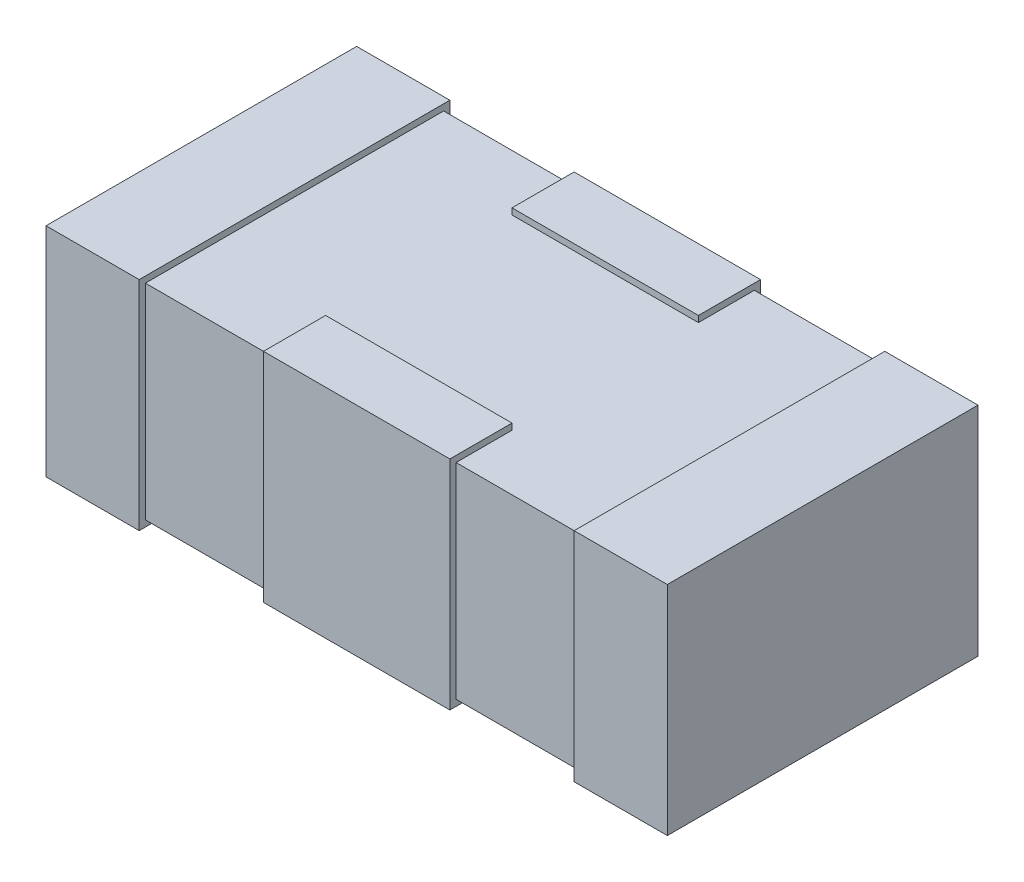
ISO-10303-21;
HEADER;
FILE_DESCRIPTION(('STEP AP214'),'2;1');
FILE_NAME('part.step','',(''),(''),'','','');
FILE_SCHEMA(('AUTOMOTIVE_DESIGN { 1 0 10303 214 1 1 1 1 }'));
ENDSEC;
DATA;
#1=APPLICATION_CONTEXT('core data for automotive mechanical design processes');
#2=APPLICATION_PROTOCOL_DEFINITION('international standard','automotive_design',2000,#1);
#3=PRODUCT_CONTEXT('',#1,'mechanical');
#4=PRODUCT('Part','Part','',(#3));
#5=PRODUCT_RELATED_PRODUCT_CATEGORY('part','',(#4));
#6=PRODUCT_DEFINITION_FORMATION('','',#4);
#7=PRODUCT_DEFINITION_CONTEXT('part definition',#1,'design');
#8=PRODUCT_DEFINITION('design','',#6,#7);
#9=PRODUCT_DEFINITION_SHAPE('','',#8);
#10=(LENGTH_UNIT() NAMED_UNIT(*) SI_UNIT(.MILLI.,.METRE.));
#11=(NAMED_UNIT(*) PLANE_ANGLE_UNIT() SI_UNIT($,.RADIAN.));
#12=(NAMED_UNIT(*) SI_UNIT($,.STERADIAN.) SOLID_ANGLE_UNIT());
#13=UNCERTAINTY_MEASURE_WITH_UNIT(LENGTH_MEASURE(1.E-05),#10,'distance_accuracy_value','');
#14=(GEOMETRIC_REPRESENTATION_CONTEXT(3) GLOBAL_UNCERTAINTY_ASSIGNED_CONTEXT((#13)) GLOBAL_UNIT_ASSIGNED_CONTEXT((#10,
#11,#12)) REPRESENTATION_CONTEXT('',''));
#15=CARTESIAN_POINT('',(0.,0.,0.));
#16=DIRECTION('',(0.,0.,1.));
#17=DIRECTION('',(1.,0.,0.));
#18=AXIS2_PLACEMENT_3D('',#15,#16,#17);
#19=CARTESIAN_POINT('',(0.5,0.35,-0.25));
#20=DIRECTION('',(-1.,0.,0.));
#21=DIRECTION('',(0.,0.,1.));
#22=AXIS2_PLACEMENT_3D('',#19,#20,#21);
#23=PLANE('',#22);
#24=DIRECTION('',(0.,1.,0.));
#25=VECTOR('',#24,1.);
#26=CARTESIAN_POINT('',(0.5,0.35,-0.25));
#27=LINE('',#26,#25);
#28=CARTESIAN_POINT('',(0.5,0.,-0.25));
#29=VERTEX_POINT('',#28);
#30=CARTESIAN_POINT('',(0.5,0.35,-0.25));
#31=VERTEX_POINT('',#30);
#32=EDGE_CURVE('E198',#29,#31,#27,.T.);
#33=ORIENTED_EDGE('',*,*,#32,.T.);
#34=DIRECTION('',(0.,0.,1.));
#35=VECTOR('',#34,1.);
#36=CARTESIAN_POINT('',(0.5,0.35,0.));
#37=LINE('',#36,#35);
#38=CARTESIAN_POINT('',(0.5,0.35,0.25));
#39=VERTEX_POINT('',#38);
#40=EDGE_CURVE('E207',#39,#31,#37,.F.);
#41=ORIENTED_EDGE('',*,*,#40,.F.);
#42=DIRECTION('',(0.,1.,0.));
#43=VECTOR('',#42,1.);
#44=CARTESIAN_POINT('',(0.5,0.35,0.25));
#45=LINE('',#44,#43);
#46=CARTESIAN_POINT('',(0.5,0.,0.25));
#47=VERTEX_POINT('',#46);
#48=EDGE_CURVE('E203',#39,#47,#45,.F.);
#49=ORIENTED_EDGE('',*,*,#48,.T.);
#50=DIRECTION('',(0.,0.,1.));
#51=VECTOR('',#50,1.);
#52=CARTESIAN_POINT('',(0.5,0.,0.));
#53=LINE('',#52,#51);
#54=EDGE_CURVE('E205',#47,#29,#53,.F.);
#55=ORIENTED_EDGE('',*,*,#54,.T.);
#56=EDGE_LOOP('',(#33,#41,#49,#55));
#57=FACE_BOUND('',#56,.T.);
#58=ADVANCED_FACE('F17',(#57),#23,.F.);
#59=CARTESIAN_POINT('',(-0.5,0.35,-0.25));
#60=DIRECTION('',(1.,0.,0.));
#61=DIRECTION('',(0.,0.,-1.));
#62=AXIS2_PLACEMENT_3D('',#59,#60,#61);
#63=PLANE('',#62);
#64=DIRECTION('',(0.,1.,0.));
#65=VECTOR('',#64,1.);
#66=CARTESIAN_POINT('',(-0.5,0.35,0.25));
#67=LINE('',#66,#65);
#68=CARTESIAN_POINT('',(-0.5,0.,0.25));
#69=VERTEX_POINT('',#68);
#70=CARTESIAN_POINT('',(-0.5,0.35,0.25));
#71=VERTEX_POINT('',#70);
#72=EDGE_CURVE('E282',#69,#71,#67,.T.);
#73=ORIENTED_EDGE('',*,*,#72,.T.);
#74=DIRECTION('',(0.,0.,1.));
#75=VECTOR('',#74,1.);
#76=CARTESIAN_POINT('',(-0.5,0.35,0.));
#77=LINE('',#76,#75);
#78=CARTESIAN_POINT('',(-0.5,0.35,-0.25));
#79=VERTEX_POINT('',#78);
#80=EDGE_CURVE('E280',#79,#71,#77,.T.);
#81=ORIENTED_EDGE('',*,*,#80,.F.);
#82=DIRECTION('',(0.,1.,0.));
#83=VECTOR('',#82,1.);
#84=CARTESIAN_POINT('',(-0.5,0.35,-0.25));
#85=LINE('',#84,#83);
#86=CARTESIAN_POINT('',(-0.5,0.,-0.25));
#87=VERTEX_POINT('',#86);
#88=EDGE_CURVE('E272',#79,#87,#85,.F.);
#89=ORIENTED_EDGE('',*,*,#88,.T.);
#90=DIRECTION('',(0.,0.,1.));
#91=VECTOR('',#90,1.);
#92=CARTESIAN_POINT('',(-0.5,0.,0.));
#93=LINE('',#92,#91);
#94=EDGE_CURVE('E269',#87,#69,#93,.T.);
#95=ORIENTED_EDGE('',*,*,#94,.T.);
#96=EDGE_LOOP('',(#73,#81,#89,#95));
#97=FACE_BOUND('',#96,.T.);
#98=ADVANCED_FACE('F573',(#97),#63,.F.);
#99=CARTESIAN_POINT('',(-0.5,0.35,-0.25));
#100=DIRECTION('',(0.,0.,1.));
#101=DIRECTION('',(1.,0.,0.));
#102=AXIS2_PLACEMENT_3D('',#99,#100,#101);
#103=PLANE('',#102);
#104=DIRECTION('',(0.,1.,0.));
#105=VECTOR('',#104,1.);
#106=CARTESIAN_POINT('',(-0.15,0.34,-0.25));
#107=LINE('',#106,#105);
#108=CARTESIAN_POINT('',(-0.15,0.,-0.25));
#109=VERTEX_POINT('',#108);
#110=CARTESIAN_POINT('',(-0.15,0.35,-0.25));
#111=VERTEX_POINT('',#110);
#112=EDGE_CURVE('E238',#109,#111,#107,.T.);
#113=ORIENTED_EDGE('',*,*,#112,.T.);
#114=DIRECTION('',(1.,0.,0.));
#115=VECTOR('',#114,1.);
#116=CARTESIAN_POINT('',(0.,0.35,-0.25));
#117=LINE('',#116,#115);
#118=CARTESIAN_POINT('',(0.15,0.35,-0.25));
#119=VERTEX_POINT('',#118);
#120=EDGE_CURVE('E213',#119,#111,#117,.F.);
#121=ORIENTED_EDGE('',*,*,#120,.F.);
#122=DIRECTION('',(0.,1.,0.));
#123=VECTOR('',#122,1.);
#124=CARTESIAN_POINT('',(0.15,0.34,-0.25));
#125=LINE('',#124,#123);
#126=CARTESIAN_POINT('',(0.15,0.,-0.25));
#127=VERTEX_POINT('',#126);
#128=EDGE_CURVE('E239',#119,#127,#125,.F.);
#129=ORIENTED_EDGE('',*,*,#128,.T.);
#130=DIRECTION('',(1.,0.,0.));
#131=VECTOR('',#130,1.);
#132=CARTESIAN_POINT('',(0.,0.,-0.25));
#133=LINE('',#132,#131);
#134=EDGE_CURVE('E20',#127,#109,#133,.F.);
#135=ORIENTED_EDGE('',*,*,#134,.T.);
#136=EDGE_LOOP('',(#113,#121,#129,#135));
#137=FACE_BOUND('',#136,.T.);
#138=ADVANCED_FACE('F236',(#137),#103,.F.);
#139=CARTESIAN_POINT('',(0.,0.,0.));
#140=DIRECTION('',(0.,1.,0.));
#141=DIRECTION('',(0.,0.,1.));
#142=AXIS2_PLACEMENT_3D('',#139,#140,#141);
#143=PLANE('',#142);
#144=DIRECTION('',(0.,0.,-1.));
#145=VECTOR('',#144,1.);
#146=CARTESIAN_POINT('',(-0.15,0.,-0.25));
#147=LINE('',#146,#145);
#148=CARTESIAN_POINT('',(-0.15,0.,-0.15));
#149=VERTEX_POINT('',#148);
#150=EDGE_CURVE('E245',#149,#109,#147,.T.);
#151=ORIENTED_EDGE('',*,*,#150,.T.);
#152=ORIENTED_EDGE('',*,*,#134,.F.);
#153=DIRECTION('',(0.,0.,1.));
#154=VECTOR('',#153,1.);
#155=CARTESIAN_POINT('',(0.15,0.,-0.25));
#156=LINE('',#155,#154);
#157=CARTESIAN_POINT('',(0.15,0.,-0.15));
#158=VERTEX_POINT('',#157);
#159=EDGE_CURVE('E340',#127,#158,#156,.T.);
#160=ORIENTED_EDGE('',*,*,#159,.T.);
#161=DIRECTION('',(-1.,0.,0.));
#162=VECTOR('',#161,1.);
#163=CARTESIAN_POINT('',(-0.15,0.,-0.15));
#164=LINE('',#163,#162);
#165=EDGE_CURVE('E227',#158,#149,#164,.T.);
#166=ORIENTED_EDGE('',*,*,#165,.T.);
#167=EDGE_LOOP('',(#151,#152,#160,#166));
#168=FACE_BOUND('',#167,.T.);
#169=ADVANCED_FACE('F250',(#168),#143,.F.);
#170=CARTESIAN_POINT('',(-0.15,0.01,-0.15));
#171=DIRECTION('',(0.,0.,-1.));
#172=DIRECTION('',(-1.,0.,0.));
#173=AXIS2_PLACEMENT_3D('',#170,#171,#172);
#174=PLANE('',#173);
#175=DIRECTION('',(0.,1.,0.));
#176=VECTOR('',#175,1.);
#177=CARTESIAN_POINT('',(0.15,0.34,-0.15));
#178=LINE('',#177,#176);
#179=CARTESIAN_POINT('',(0.15,0.01,-0.15));
#180=VERTEX_POINT('',#179);
#181=EDGE_CURVE('E337',#158,#180,#178,.T.);
#182=ORIENTED_EDGE('',*,*,#181,.T.);
#183=DIRECTION('',(1.,0.,0.));
#184=VECTOR('',#183,1.);
#185=CARTESIAN_POINT('',(0.,0.01,-0.15));
#186=LINE('',#185,#184);
#187=CARTESIAN_POINT('',(-0.15,0.01,-0.15));
#188=VERTEX_POINT('',#187);
#189=EDGE_CURVE('E259',#180,#188,#186,.F.);
#190=ORIENTED_EDGE('',*,*,#189,.T.);
#191=DIRECTION('',(0.,1.,0.));
#192=VECTOR('',#191,1.);
#193=CARTESIAN_POINT('',(-0.15,0.34,-0.15));
#194=LINE('',#193,#192);
#195=EDGE_CURVE('E251',#188,#149,#194,.F.);
#196=ORIENTED_EDGE('',*,*,#195,.T.);
#197=ORIENTED_EDGE('',*,*,#165,.F.);
#198=EDGE_LOOP('',(#182,#190,#196,#197));
#199=FACE_BOUND('',#198,.T.);
#200=ADVANCED_FACE('F473',(#199),#174,.F.);
#201=CARTESIAN_POINT('',(0.,0.35,0.));
#202=DIRECTION('',(0.,1.,0.));
#203=DIRECTION('',(0.,0.,1.));
#204=AXIS2_PLACEMENT_3D('',#201,#202,#203);
#205=PLANE('',#204);
#206=DIRECTION('',(0.,0.,1.));
#207=VECTOR('',#206,1.);
#208=CARTESIAN_POINT('',(0.15,0.35,-0.25));
#209=LINE('',#208,#207);
#210=CARTESIAN_POINT('',(0.15,0.35,-0.15));
#211=VERTEX_POINT('',#210);
#212=EDGE_CURVE('E328',#211,#119,#209,.F.);
#213=ORIENTED_EDGE('',*,*,#212,.T.);
#214=ORIENTED_EDGE('',*,*,#120,.T.);
#215=DIRECTION('',(0.,0.,-1.));
#216=VECTOR('',#215,1.);
#217=CARTESIAN_POINT('',(-0.15,0.35,-0.25));
#218=LINE('',#217,#216);
#219=CARTESIAN_POINT('',(-0.15,0.35,-0.15));
#220=VERTEX_POINT('',#219);
#221=EDGE_CURVE('E248',#111,#220,#218,.F.);
#222=ORIENTED_EDGE('',*,*,#221,.T.);
#223=DIRECTION('',(-1.,0.,0.));
#224=VECTOR('',#223,1.);
#225=CARTESIAN_POINT('',(-0.15,0.35,-0.15));
#226=LINE('',#225,#224);
#227=EDGE_CURVE('E343',#220,#211,#226,.F.);
#228=ORIENTED_EDGE('',*,*,#227,.T.);
#229=EDGE_LOOP('',(#213,#214,#222,#228));
#230=FACE_BOUND('',#229,.T.);
#231=ADVANCED_FACE('F348',(#230),#205,.T.);
#232=CARTESIAN_POINT('',(-0.5,0.35,0.25));
#233=DIRECTION('',(0.,0.,-1.));
#234=DIRECTION('',(-1.,0.,0.));
#235=AXIS2_PLACEMENT_3D('',#232,#233,#234);
#236=PLANE('',#235);
#237=DIRECTION('',(1.,0.,0.));
#238=VECTOR('',#237,1.);
#239=CARTESIAN_POINT('',(0.,0.,0.25));
#240=LINE('',#239,#238);
#241=CARTESIAN_POINT('',(0.35,0.,0.25));
#242=VERTEX_POINT('',#241);
#243=EDGE_CURVE('E212',#242,#47,#240,.T.);
#244=ORIENTED_EDGE('',*,*,#243,.T.);
#245=ORIENTED_EDGE('',*,*,#48,.F.);
#246=DIRECTION('',(1.,0.,0.));
#247=VECTOR('',#246,1.);
#248=CARTESIAN_POINT('',(0.,0.35,0.25));
#249=LINE('',#248,#247);
#250=CARTESIAN_POINT('',(0.35,0.35,0.25));
#251=VERTEX_POINT('',#250);
#252=EDGE_CURVE('E294',#251,#39,#249,.T.);
#253=ORIENTED_EDGE('',*,*,#252,.F.);
#254=DIRECTION('',(0.,1.,0.));
#255=VECTOR('',#254,1.);
#256=CARTESIAN_POINT('',(0.35,0.34,0.25));
#257=LINE('',#256,#255);
#258=EDGE_CURVE('E223',#251,#242,#257,.F.);
#259=ORIENTED_EDGE('',*,*,#258,.T.);
#260=EDGE_LOOP('',(#244,#245,#253,#259));
#261=FACE_BOUND('',#260,.T.);
#262=ADVANCED_FACE('F222',(#261),#236,.F.);
#263=CARTESIAN_POINT('',(0.,0.,0.));
#264=DIRECTION('',(0.,1.,0.));
#265=DIRECTION('',(0.,0.,1.));
#266=AXIS2_PLACEMENT_3D('',#263,#264,#265);
#267=PLANE('',#266);
#268=DIRECTION('',(1.,0.,0.));
#269=VECTOR('',#268,1.);
#270=CARTESIAN_POINT('',(-0.5,0.,-0.25));
#271=LINE('',#270,#269);
#272=CARTESIAN_POINT('',(0.35,0.,-0.25));
#273=VERTEX_POINT('',#272);
#274=EDGE_CURVE('E219',#273,#29,#271,.T.);
#275=ORIENTED_EDGE('',*,*,#274,.T.);
#276=ORIENTED_EDGE('',*,*,#54,.F.);
#277=ORIENTED_EDGE('',*,*,#243,.F.);
#278=DIRECTION('',(0.,0.,-1.));
#279=VECTOR('',#278,1.);
#280=CARTESIAN_POINT('',(0.35,0.,0.25));
#281=LINE('',#280,#279);
#282=EDGE_CURVE('E313',#242,#273,#281,.T.);
#283=ORIENTED_EDGE('',*,*,#282,.T.);
#284=EDGE_LOOP('',(#275,#276,#277,#283));
#285=FACE_BOUND('',#284,.T.);
#286=ADVANCED_FACE('F216',(#285),#267,.F.);
#287=CARTESIAN_POINT('',(-0.5,0.35,-0.25));
#288=DIRECTION('',(0.,0.,1.));
#289=DIRECTION('',(1.,0.,0.));
#290=AXIS2_PLACEMENT_3D('',#287,#288,#289);
#291=PLANE('',#290);
#292=DIRECTION('',(0.,1.,0.));
#293=VECTOR('',#292,1.);
#294=CARTESIAN_POINT('',(0.35,0.34,-0.25));
#295=LINE('',#294,#293);
#296=CARTESIAN_POINT('',(0.35,0.35,-0.25));
#297=VERTEX_POINT('',#296);
#298=EDGE_CURVE('E299',#273,#297,#295,.T.);
#299=ORIENTED_EDGE('',*,*,#298,.T.);
#300=DIRECTION('',(1.,0.,0.));
#301=VECTOR('',#300,1.);
#302=CARTESIAN_POINT('',(0.,0.35,-0.25));
#303=LINE('',#302,#301);
#304=EDGE_CURVE('E291',#31,#297,#303,.F.);
#305=ORIENTED_EDGE('',*,*,#304,.F.);
#306=ORIENTED_EDGE('',*,*,#32,.F.);
#307=ORIENTED_EDGE('',*,*,#274,.F.);
#308=EDGE_LOOP('',(#299,#305,#306,#307));
#309=FACE_BOUND('',#308,.T.);
#310=ADVANCED_FACE('F297',(#309),#291,.F.);
#311=CARTESIAN_POINT('',(0.,0.35,0.));
#312=DIRECTION('',(0.,1.,0.));
#313=DIRECTION('',(0.,0.,1.));
#314=AXIS2_PLACEMENT_3D('',#311,#312,#313);
#315=PLANE('',#314);
#316=ORIENTED_EDGE('',*,*,#40,.T.);
#317=ORIENTED_EDGE('',*,*,#304,.T.);
#318=DIRECTION('',(0.,0.,-1.));
#319=VECTOR('',#318,1.);
#320=CARTESIAN_POINT('',(0.35,0.35,0.25));
#321=LINE('',#320,#319);
#322=EDGE_CURVE('E304',#297,#251,#321,.F.);
#323=ORIENTED_EDGE('',*,*,#322,.T.);
#324=ORIENTED_EDGE('',*,*,#252,.T.);
#325=EDGE_LOOP('',(#316,#317,#323,#324));
#326=FACE_BOUND('',#325,.T.);
#327=ADVANCED_FACE('F303',(#326),#315,.T.);
#328=CARTESIAN_POINT('',(-0.5,0.35,0.25));
#329=DIRECTION('',(0.,0.,-1.));
#330=DIRECTION('',(-1.,0.,0.));
#331=AXIS2_PLACEMENT_3D('',#328,#329,#330);
#332=PLANE('',#331);
#333=DIRECTION('',(0.,1.,0.));
#334=VECTOR('',#333,1.);
#335=CARTESIAN_POINT('',(0.15,0.34,0.25));
#336=LINE('',#335,#334);
#337=CARTESIAN_POINT('',(0.15,0.,0.25));
#338=VERTEX_POINT('',#337);
#339=CARTESIAN_POINT('',(0.15,0.35,0.25));
#340=VERTEX_POINT('',#339);
#341=EDGE_CURVE('E417',#338,#340,#336,.T.);
#342=ORIENTED_EDGE('',*,*,#341,.T.);
#343=DIRECTION('',(1.,0.,0.));
#344=VECTOR('',#343,1.);
#345=CARTESIAN_POINT('',(0.,0.35,0.25));
#346=LINE('',#345,#344);
#347=CARTESIAN_POINT('',(-0.15,0.35,0.25));
#348=VERTEX_POINT('',#347);
#349=EDGE_CURVE('E285',#348,#340,#346,.T.);
#350=ORIENTED_EDGE('',*,*,#349,.F.);
#351=DIRECTION('',(0.,1.,0.));
#352=VECTOR('',#351,1.);
#353=CARTESIAN_POINT('',(-0.15,0.34,0.25));
#354=LINE('',#353,#352);
#355=CARTESIAN_POINT('',(-0.15,0.,0.25));
#356=VERTEX_POINT('',#355);
#357=EDGE_CURVE('E407',#348,#356,#354,.F.);
#358=ORIENTED_EDGE('',*,*,#357,.T.);
#359=DIRECTION('',(1.,0.,0.));
#360=VECTOR('',#359,1.);
#361=CARTESIAN_POINT('',(0.,0.,0.25));
#362=LINE('',#361,#360);
#363=EDGE_CURVE('E289',#356,#338,#362,.T.);
#364=ORIENTED_EDGE('',*,*,#363,.T.);
#365=EDGE_LOOP('',(#342,#350,#358,#364));
#366=FACE_BOUND('',#365,.T.);
#367=ADVANCED_FACE('F499',(#366),#332,.F.);
#368=CARTESIAN_POINT('',(0.,0.,0.));
#369=DIRECTION('',(0.,1.,0.));
#370=DIRECTION('',(0.,0.,1.));
#371=AXIS2_PLACEMENT_3D('',#368,#369,#370);
#372=PLANE('',#371);
#373=DIRECTION('',(1.,0.,0.));
#374=VECTOR('',#373,1.);
#375=CARTESIAN_POINT('',(0.15,0.,0.15));
#376=LINE('',#375,#374);
#377=CARTESIAN_POINT('',(-0.15,0.,0.15));
#378=VERTEX_POINT('',#377);
#379=CARTESIAN_POINT('',(0.15,0.,0.15));
#380=VERTEX_POINT('',#379);
#381=EDGE_CURVE('E287',#378,#380,#376,.T.);
#382=ORIENTED_EDGE('',*,*,#381,.T.);
#383=DIRECTION('',(0.,0.,1.));
#384=VECTOR('',#383,1.);
#385=CARTESIAN_POINT('',(0.15,0.,0.15));
#386=LINE('',#385,#384);
#387=EDGE_CURVE('E420',#380,#338,#386,.T.);
#388=ORIENTED_EDGE('',*,*,#387,.T.);
#389=ORIENTED_EDGE('',*,*,#363,.F.);
#390=DIRECTION('',(0.,0.,-1.));
#391=VECTOR('',#390,1.);
#392=CARTESIAN_POINT('',(-0.15,0.,0.15));
#393=LINE('',#392,#391);
#394=EDGE_CURVE('E404',#356,#378,#393,.T.);
#395=ORIENTED_EDGE('',*,*,#394,.T.);
#396=EDGE_LOOP('',(#382,#388,#389,#395));
#397=FACE_BOUND('',#396,.T.);
#398=ADVANCED_FACE('F502',(#397),#372,.F.);
#399=CARTESIAN_POINT('',(0.15,0.01,0.15));
#400=DIRECTION('',(0.,0.,1.));
#401=DIRECTION('',(1.,0.,0.));
#402=AXIS2_PLACEMENT_3D('',#399,#400,#401);
#403=PLANE('',#402);
#404=DIRECTION('',(0.,1.,0.));
#405=VECTOR('',#404,1.);
#406=CARTESIAN_POINT('',(-0.15,0.34,0.15));
#407=LINE('',#406,#405);
#408=CARTESIAN_POINT('',(-0.15,0.01,0.15));
#409=VERTEX_POINT('',#408);
#410=EDGE_CURVE('E401',#378,#409,#407,.T.);
#411=ORIENTED_EDGE('',*,*,#410,.T.);
#412=DIRECTION('',(1.,0.,0.));
#413=VECTOR('',#412,1.);
#414=CARTESIAN_POINT('',(0.,0.01,0.15));
#415=LINE('',#414,#413);
#416=CARTESIAN_POINT('',(0.15,0.01,0.15));
#417=VERTEX_POINT('',#416);
#418=EDGE_CURVE('E261',#409,#417,#415,.T.);
#419=ORIENTED_EDGE('',*,*,#418,.T.);
#420=DIRECTION('',(0.,1.,0.));
#421=VECTOR('',#420,1.);
#422=CARTESIAN_POINT('',(0.15,0.34,0.15));
#423=LINE('',#422,#421);
#424=EDGE_CURVE('E423',#417,#380,#423,.F.);
#425=ORIENTED_EDGE('',*,*,#424,.T.);
#426=ORIENTED_EDGE('',*,*,#381,.F.);
#427=EDGE_LOOP('',(#411,#419,#425,#426));
#428=FACE_BOUND('',#427,.T.);
#429=ADVANCED_FACE('F509',(#428),#403,.F.);
#430=CARTESIAN_POINT('',(0.,0.35,0.));
#431=DIRECTION('',(0.,1.,0.));
#432=DIRECTION('',(0.,0.,1.));
#433=AXIS2_PLACEMENT_3D('',#430,#431,#432);
#434=PLANE('',#433);
#435=DIRECTION('',(0.,0.,-1.));
#436=VECTOR('',#435,1.);
#437=CARTESIAN_POINT('',(-0.15,0.35,0.15));
#438=LINE('',#437,#436);
#439=CARTESIAN_POINT('',(-0.15,0.35,0.15));
#440=VERTEX_POINT('',#439);
#441=EDGE_CURVE('E393',#440,#348,#438,.F.);
#442=ORIENTED_EDGE('',*,*,#441,.T.);
#443=ORIENTED_EDGE('',*,*,#349,.T.);
#444=DIRECTION('',(0.,0.,1.));
#445=VECTOR('',#444,1.);
#446=CARTESIAN_POINT('',(0.15,0.35,0.15));
#447=LINE('',#446,#445);
#448=CARTESIAN_POINT('',(0.15,0.35,0.15));
#449=VERTEX_POINT('',#448);
#450=EDGE_CURVE('E415',#340,#449,#447,.F.);
#451=ORIENTED_EDGE('',*,*,#450,.T.);
#452=DIRECTION('',(1.,0.,0.));
#453=VECTOR('',#452,1.);
#454=CARTESIAN_POINT('',(-0.15,0.35,0.15));
#455=LINE('',#454,#453);
#456=EDGE_CURVE('E410',#449,#440,#455,.F.);
#457=ORIENTED_EDGE('',*,*,#456,.T.);
#458=EDGE_LOOP('',(#442,#443,#451,#457));
#459=FACE_BOUND('',#458,.T.);
#460=ADVANCED_FACE('F513',(#459),#434,.T.);
#461=CARTESIAN_POINT('',(-0.5,0.35,0.25));
#462=DIRECTION('',(0.,0.,-1.));
#463=DIRECTION('',(-1.,0.,0.));
#464=AXIS2_PLACEMENT_3D('',#461,#462,#463);
#465=PLANE('',#464);
#466=DIRECTION('',(0.,1.,0.));
#467=VECTOR('',#466,1.);
#468=CARTESIAN_POINT('',(-0.35,0.34,0.25));
#469=LINE('',#468,#467);
#470=CARTESIAN_POINT('',(-0.35,0.,0.25));
#471=VERTEX_POINT('',#470);
#472=CARTESIAN_POINT('',(-0.35,0.35,0.25));
#473=VERTEX_POINT('',#472);
#474=EDGE_CURVE('E385',#471,#473,#469,.T.);
#475=ORIENTED_EDGE('',*,*,#474,.T.);
#476=DIRECTION('',(1.,0.,0.));
#477=VECTOR('',#476,1.);
#478=CARTESIAN_POINT('',(0.,0.35,0.25));
#479=LINE('',#478,#477);
#480=EDGE_CURVE('E278',#71,#473,#479,.T.);
#481=ORIENTED_EDGE('',*,*,#480,.F.);
#482=ORIENTED_EDGE('',*,*,#72,.F.);
#483=DIRECTION('',(1.,0.,0.));
#484=VECTOR('',#483,1.);
#485=CARTESIAN_POINT('',(0.,0.,0.25));
#486=LINE('',#485,#484);
#487=EDGE_CURVE('E266',#69,#471,#486,.T.);
#488=ORIENTED_EDGE('',*,*,#487,.T.);
#489=EDGE_LOOP('',(#475,#481,#482,#488));
#490=FACE_BOUND('',#489,.T.);
#491=ADVANCED_FACE('F515',(#490),#465,.F.);
#492=CARTESIAN_POINT('',(0.,0.35,0.));
#493=DIRECTION('',(0.,1.,0.));
#494=DIRECTION('',(0.,0.,1.));
#495=AXIS2_PLACEMENT_3D('',#492,#493,#494);
#496=PLANE('',#495);
#497=ORIENTED_EDGE('',*,*,#80,.T.);
#498=ORIENTED_EDGE('',*,*,#480,.T.);
#499=DIRECTION('',(0.,0.,1.));
#500=VECTOR('',#499,1.);
#501=CARTESIAN_POINT('',(-0.35,0.35,-0.25));
#502=LINE('',#501,#500);
#503=CARTESIAN_POINT('',(-0.35,0.35,-0.25));
#504=VERTEX_POINT('',#503);
#505=EDGE_CURVE('E382',#473,#504,#502,.F.);
#506=ORIENTED_EDGE('',*,*,#505,.T.);
#507=DIRECTION('',(1.,0.,0.));
#508=VECTOR('',#507,1.);
#509=CARTESIAN_POINT('',(-0.5,0.35,-0.25));
#510=LINE('',#509,#508);
#511=EDGE_CURVE('E275',#504,#79,#510,.F.);
#512=ORIENTED_EDGE('',*,*,#511,.T.);
#513=EDGE_LOOP('',(#497,#498,#506,#512));
#514=FACE_BOUND('',#513,.T.);
#515=ADVANCED_FACE('F522',(#514),#496,.T.);
#516=CARTESIAN_POINT('',(-0.5,0.35,-0.25));
#517=DIRECTION('',(0.,0.,1.));
#518=DIRECTION('',(1.,0.,0.));
#519=AXIS2_PLACEMENT_3D('',#516,#517,#518);
#520=PLANE('',#519);
#521=DIRECTION('',(1.,0.,0.));
#522=VECTOR('',#521,1.);
#523=CARTESIAN_POINT('',(0.,0.,-0.25));
#524=LINE('',#523,#522);
#525=CARTESIAN_POINT('',(-0.35,0.,-0.25));
#526=VERTEX_POINT('',#525);
#527=EDGE_CURVE('E263',#526,#87,#524,.F.);
#528=ORIENTED_EDGE('',*,*,#527,.T.);
#529=ORIENTED_EDGE('',*,*,#88,.F.);
#530=ORIENTED_EDGE('',*,*,#511,.F.);
#531=DIRECTION('',(0.,1.,0.));
#532=VECTOR('',#531,1.);
#533=CARTESIAN_POINT('',(-0.35,0.34,-0.25));
#534=LINE('',#533,#532);
#535=EDGE_CURVE('E379',#504,#526,#534,.F.);
#536=ORIENTED_EDGE('',*,*,#535,.T.);
#537=EDGE_LOOP('',(#528,#529,#530,#536));
#538=FACE_BOUND('',#537,.T.);
#539=ADVANCED_FACE('F560',(#538),#520,.F.);
#540=CARTESIAN_POINT('',(0.,0.,0.));
#541=DIRECTION('',(0.,1.,0.));
#542=DIRECTION('',(0.,0.,1.));
#543=AXIS2_PLACEMENT_3D('',#540,#541,#542);
#544=PLANE('',#543);
#545=DIRECTION('',(0.,0.,1.));
#546=VECTOR('',#545,1.);
#547=CARTESIAN_POINT('',(-0.35,0.,-0.25));
#548=LINE('',#547,#546);
#549=EDGE_CURVE('E376',#526,#471,#548,.T.);
#550=ORIENTED_EDGE('',*,*,#549,.T.);
#551=ORIENTED_EDGE('',*,*,#487,.F.);
#552=ORIENTED_EDGE('',*,*,#94,.F.);
#553=ORIENTED_EDGE('',*,*,#527,.F.);
#554=EDGE_LOOP('',(#550,#551,#552,#553));
#555=FACE_BOUND('',#554,.T.);
#556=ADVANCED_FACE('F557',(#555),#544,.F.);
#557=CARTESIAN_POINT('',(0.,0.01,0.));
#558=DIRECTION('',(0.,1.,0.));
#559=DIRECTION('',(0.,0.,1.));
#560=AXIS2_PLACEMENT_3D('',#557,#558,#559);
#561=PLANE('',#560);
#562=ORIENTED_EDGE('',*,*,#189,.F.);
#563=DIRECTION('',(0.,0.,1.));
#564=VECTOR('',#563,1.);
#565=CARTESIAN_POINT('',(0.15,0.01,-0.25));
#566=LINE('',#565,#564);
#567=CARTESIAN_POINT('',(0.15,0.01,-0.24));
#568=VERTEX_POINT('',#567);
#569=EDGE_CURVE('E334',#180,#568,#566,.F.);
#570=ORIENTED_EDGE('',*,*,#569,.T.);
#571=DIRECTION('',(-1.,0.,0.));
#572=VECTOR('',#571,1.);
#573=CARTESIAN_POINT('',(0.,0.01,-0.24));
#574=LINE('',#573,#572);
#575=CARTESIAN_POINT('',(0.35,0.01,-0.24));
#576=VERTEX_POINT('',#575);
#577=EDGE_CURVE('E326',#576,#568,#574,.T.);
#578=ORIENTED_EDGE('',*,*,#577,.F.);
#579=DIRECTION('',(0.,0.,-1.));
#580=VECTOR('',#579,1.);
#581=CARTESIAN_POINT('',(0.35,0.01,0.25));
#582=LINE('',#581,#580);
#583=CARTESIAN_POINT('',(0.35,0.01,0.24));
#584=VERTEX_POINT('',#583);
#585=EDGE_CURVE('E319',#576,#584,#582,.F.);
#586=ORIENTED_EDGE('',*,*,#585,.T.);
#587=DIRECTION('',(-1.,0.,0.));
#588=VECTOR('',#587,1.);
#589=CARTESIAN_POINT('',(0.,0.01,0.24));
#590=LINE('',#589,#588);
#591=CARTESIAN_POINT('',(0.15,0.01,0.24));
#592=VERTEX_POINT('',#591);
#593=EDGE_CURVE('E311',#584,#592,#590,.T.);
#594=ORIENTED_EDGE('',*,*,#593,.T.);
#595=DIRECTION('',(0.,0.,1.));
#596=VECTOR('',#595,1.);
#597=CARTESIAN_POINT('',(0.15,0.01,0.15));
#598=LINE('',#597,#596);
#599=EDGE_CURVE('E426',#592,#417,#598,.F.);
#600=ORIENTED_EDGE('',*,*,#599,.T.);
#601=ORIENTED_EDGE('',*,*,#418,.F.);
#602=DIRECTION('',(0.,0.,-1.));
#603=VECTOR('',#602,1.);
#604=CARTESIAN_POINT('',(-0.15,0.01,0.15));
#605=LINE('',#604,#603);
#606=CARTESIAN_POINT('',(-0.15,0.01,0.24));
#607=VERTEX_POINT('',#606);
#608=EDGE_CURVE('E399',#409,#607,#605,.F.);
#609=ORIENTED_EDGE('',*,*,#608,.T.);
#610=DIRECTION('',(-1.,0.,0.));
#611=VECTOR('',#610,1.);
#612=CARTESIAN_POINT('',(0.,0.01,0.24));
#613=LINE('',#612,#611);
#614=CARTESIAN_POINT('',(-0.35,0.01,0.24));
#615=VERTEX_POINT('',#614);
#616=EDGE_CURVE('E388',#607,#615,#613,.T.);
#617=ORIENTED_EDGE('',*,*,#616,.T.);
#618=DIRECTION('',(0.,0.,1.));
#619=VECTOR('',#618,1.);
#620=CARTESIAN_POINT('',(-0.35,0.01,-0.25));
#621=LINE('',#620,#619);
#622=CARTESIAN_POINT('',(-0.35,0.01,-0.24));
#623=VERTEX_POINT('',#622);
#624=EDGE_CURVE('E370',#615,#623,#621,.F.);
#625=ORIENTED_EDGE('',*,*,#624,.T.);
#626=DIRECTION('',(-1.,0.,0.));
#627=VECTOR('',#626,1.);
#628=CARTESIAN_POINT('',(0.,0.01,-0.24));
#629=LINE('',#628,#627);
#630=CARTESIAN_POINT('',(-0.15,0.01,-0.24));
#631=VERTEX_POINT('',#630);
#632=EDGE_CURVE('E368',#631,#623,#629,.T.);
#633=ORIENTED_EDGE('',*,*,#632,.F.);
#634=DIRECTION('',(0.,0.,-1.));
#635=VECTOR('',#634,1.);
#636=CARTESIAN_POINT('',(-0.15,0.01,-0.25));
#637=LINE('',#636,#635);
#638=EDGE_CURVE('E253',#631,#188,#637,.F.);
#639=ORIENTED_EDGE('',*,*,#638,.T.);
#640=EDGE_LOOP('',(#562,#570,#578,#586,#594,#600,#601,#609,#617,#625,#633,#639));
#641=FACE_BOUND('',#640,.T.);
#642=ADVANCED_FACE('F434',(#641),#561,.F.);
#643=CARTESIAN_POINT('',(-0.15,0.34,-0.25));
#644=DIRECTION('',(1.,0.,0.));
#645=DIRECTION('',(0.,0.,-1.));
#646=AXIS2_PLACEMENT_3D('',#643,#644,#645);
#647=PLANE('',#646);
#648=ORIENTED_EDGE('',*,*,#112,.F.);
#649=ORIENTED_EDGE('',*,*,#150,.F.);
#650=ORIENTED_EDGE('',*,*,#195,.F.);
#651=ORIENTED_EDGE('',*,*,#638,.F.);
#652=DIRECTION('',(0.,1.,0.));
#653=VECTOR('',#652,1.);
#654=CARTESIAN_POINT('',(-0.15,0.,-0.24));
#655=LINE('',#654,#653);
#656=CARTESIAN_POINT('',(-0.15,0.34,-0.24));
#657=VERTEX_POINT('',#656);
#658=EDGE_CURVE('E358',#657,#631,#655,.F.);
#659=ORIENTED_EDGE('',*,*,#658,.F.);
#660=DIRECTION('',(0.,0.,-1.));
#661=VECTOR('',#660,1.);
#662=CARTESIAN_POINT('',(-0.15,0.34,0.));
#663=LINE('',#662,#661);
#664=CARTESIAN_POINT('',(-0.15,0.34,-0.15));
#665=VERTEX_POINT('',#664);
#666=EDGE_CURVE('E356',#657,#665,#663,.F.);
#667=ORIENTED_EDGE('',*,*,#666,.T.);
#668=DIRECTION('',(0.,1.,0.));
#669=VECTOR('',#668,1.);
#670=CARTESIAN_POINT('',(-0.15,0.34,-0.15));
#671=LINE('',#670,#669);
#672=EDGE_CURVE('E345',#665,#220,#671,.T.);
#673=ORIENTED_EDGE('',*,*,#672,.T.);
#674=ORIENTED_EDGE('',*,*,#221,.F.);
#675=EDGE_LOOP('',(#648,#649,#650,#651,#659,#667,#673,#674));
#676=FACE_BOUND('',#675,.T.);
#677=ADVANCED_FACE('F243',(#676),#647,.F.);
#678=CARTESIAN_POINT('',(-0.15,0.34,-0.15));
#679=DIRECTION('',(0.,0.,-1.));
#680=DIRECTION('',(-1.,0.,0.));
#681=AXIS2_PLACEMENT_3D('',#678,#679,#680);
#682=PLANE('',#681);
#683=ORIENTED_EDGE('',*,*,#672,.F.);
#684=DIRECTION('',(1.,0.,0.));
#685=VECTOR('',#684,1.);
#686=CARTESIAN_POINT('',(0.,0.34,-0.15));
#687=LINE('',#686,#685);
#688=CARTESIAN_POINT('',(0.15,0.34,-0.15));
#689=VERTEX_POINT('',#688);
#690=EDGE_CURVE('E360',#665,#689,#687,.T.);
#691=ORIENTED_EDGE('',*,*,#690,.T.);
#692=DIRECTION('',(0.,1.,0.));
#693=VECTOR('',#692,1.);
#694=CARTESIAN_POINT('',(0.15,0.34,-0.15));
#695=LINE('',#694,#693);
#696=EDGE_CURVE('E331',#689,#211,#695,.T.);
#697=ORIENTED_EDGE('',*,*,#696,.T.);
#698=ORIENTED_EDGE('',*,*,#227,.F.);
#699=EDGE_LOOP('',(#683,#691,#697,#698));
#700=FACE_BOUND('',#699,.T.);
#701=ADVANCED_FACE('F351',(#700),#682,.F.);
#702=CARTESIAN_POINT('',(0.15,0.34,-0.25));
#703=DIRECTION('',(-1.,0.,0.));
#704=DIRECTION('',(0.,0.,1.));
#705=AXIS2_PLACEMENT_3D('',#702,#703,#704);
#706=PLANE('',#705);
#707=ORIENTED_EDGE('',*,*,#696,.F.);
#708=DIRECTION('',(0.,0.,-1.));
#709=VECTOR('',#708,1.);
#710=CARTESIAN_POINT('',(0.15,0.34,0.));
#711=LINE('',#710,#709);
#712=CARTESIAN_POINT('',(0.15,0.34,-0.24));
#713=VERTEX_POINT('',#712);
#714=EDGE_CURVE('E362',#689,#713,#711,.T.);
#715=ORIENTED_EDGE('',*,*,#714,.T.);
#716=DIRECTION('',(0.,1.,0.));
#717=VECTOR('',#716,1.);
#718=CARTESIAN_POINT('',(0.15,0.,-0.24));
#719=LINE('',#718,#717);
#720=EDGE_CURVE('E324',#568,#713,#719,.T.);
#721=ORIENTED_EDGE('',*,*,#720,.F.);
#722=ORIENTED_EDGE('',*,*,#569,.F.);
#723=ORIENTED_EDGE('',*,*,#181,.F.);
#724=ORIENTED_EDGE('',*,*,#159,.F.);
#725=ORIENTED_EDGE('',*,*,#128,.F.);
#726=ORIENTED_EDGE('',*,*,#212,.F.);
#727=EDGE_LOOP('',(#707,#715,#721,#722,#723,#724,#725,#726));
#728=FACE_BOUND('',#727,.T.);
#729=ADVANCED_FACE('F464',(#728),#706,.F.);
#730=CARTESIAN_POINT('',(0.,0.,-0.24));
#731=DIRECTION('',(0.,0.,-1.));
#732=DIRECTION('',(-1.,0.,0.));
#733=AXIS2_PLACEMENT_3D('',#730,#731,#732);
#734=PLANE('',#733);
#735=DIRECTION('',(1.,0.,0.));
#736=VECTOR('',#735,1.);
#737=CARTESIAN_POINT('',(0.,0.34,-0.24));
#738=LINE('',#737,#736);
#739=CARTESIAN_POINT('',(0.35,0.34,-0.24));
#740=VERTEX_POINT('',#739);
#741=EDGE_CURVE('E455',#713,#740,#738,.T.);
#742=ORIENTED_EDGE('',*,*,#741,.T.);
#743=DIRECTION('',(0.,1.,0.));
#744=VECTOR('',#743,1.);
#745=CARTESIAN_POINT('',(0.35,0.34,-0.24));
#746=LINE('',#745,#744);
#747=EDGE_CURVE('E321',#740,#576,#746,.F.);
#748=ORIENTED_EDGE('',*,*,#747,.T.);
#749=ORIENTED_EDGE('',*,*,#577,.T.);
#750=ORIENTED_EDGE('',*,*,#720,.T.);
#751=EDGE_LOOP('',(#742,#748,#749,#750));
#752=FACE_BOUND('',#751,.T.);
#753=ADVANCED_FACE('F470',(#752),#734,.T.);
#754=CARTESIAN_POINT('',(0.35,0.34,0.25));
#755=DIRECTION('',(1.,0.,0.));
#756=DIRECTION('',(0.,0.,-1.));
#757=AXIS2_PLACEMENT_3D('',#754,#755,#756);
#758=PLANE('',#757);
#759=ORIENTED_EDGE('',*,*,#298,.F.);
#760=ORIENTED_EDGE('',*,*,#282,.F.);
#761=ORIENTED_EDGE('',*,*,#258,.F.);
#762=ORIENTED_EDGE('',*,*,#322,.F.);
#763=EDGE_LOOP('',(#759,#760,#761,#762));
#764=FACE_BOUND('',#763,.T.);
#765=ORIENTED_EDGE('',*,*,#585,.F.);
#766=ORIENTED_EDGE('',*,*,#747,.F.);
#767=DIRECTION('',(0.,0.,-1.));
#768=VECTOR('',#767,1.);
#769=CARTESIAN_POINT('',(0.35,0.34,0.));
#770=LINE('',#769,#768);
#771=CARTESIAN_POINT('',(0.35,0.34,0.24));
#772=VERTEX_POINT('',#771);
#773=EDGE_CURVE('E451',#740,#772,#770,.F.);
#774=ORIENTED_EDGE('',*,*,#773,.T.);
#775=DIRECTION('',(0.,1.,0.));
#776=VECTOR('',#775,1.);
#777=CARTESIAN_POINT('',(0.35,0.,0.24));
#778=LINE('',#777,#776);
#779=EDGE_CURVE('E308',#772,#584,#778,.F.);
#780=ORIENTED_EDGE('',*,*,#779,.T.);
#781=EDGE_LOOP('',(#765,#766,#774,#780));
#782=FACE_BOUND('',#781,.T.);
#783=ADVANCED_FACE('F306',(#764,#782),#758,.F.);
#784=CARTESIAN_POINT('',(0.,0.,0.24));
#785=DIRECTION('',(0.,0.,-1.));
#786=DIRECTION('',(-1.,0.,0.));
#787=AXIS2_PLACEMENT_3D('',#784,#785,#786);
#788=PLANE('',#787);
#789=ORIENTED_EDGE('',*,*,#593,.F.);
#790=ORIENTED_EDGE('',*,*,#779,.F.);
#791=DIRECTION('',(1.,0.,0.));
#792=VECTOR('',#791,1.);
#793=CARTESIAN_POINT('',(0.,0.34,0.24));
#794=LINE('',#793,#792);
#795=CARTESIAN_POINT('',(0.15,0.34,0.24));
#796=VERTEX_POINT('',#795);
#797=EDGE_CURVE('E447',#772,#796,#794,.F.);
#798=ORIENTED_EDGE('',*,*,#797,.T.);
#799=DIRECTION('',(0.,1.,0.));
#800=VECTOR('',#799,1.);
#801=CARTESIAN_POINT('',(0.15,0.34,0.24));
#802=LINE('',#801,#800);
#803=EDGE_CURVE('E429',#796,#592,#802,.F.);
#804=ORIENTED_EDGE('',*,*,#803,.T.);
#805=EDGE_LOOP('',(#789,#790,#798,#804));
#806=FACE_BOUND('',#805,.T.);
#807=ADVANCED_FACE('F445',(#806),#788,.F.);
#808=CARTESIAN_POINT('',(0.15,0.34,0.15));
#809=DIRECTION('',(-1.,0.,0.));
#810=DIRECTION('',(0.,0.,1.));
#811=AXIS2_PLACEMENT_3D('',#808,#809,#810);
#812=PLANE('',#811);
#813=ORIENTED_EDGE('',*,*,#341,.F.);
#814=ORIENTED_EDGE('',*,*,#387,.F.);
#815=ORIENTED_EDGE('',*,*,#424,.F.);
#816=ORIENTED_EDGE('',*,*,#599,.F.);
#817=ORIENTED_EDGE('',*,*,#803,.F.);
#818=DIRECTION('',(0.,0.,-1.));
#819=VECTOR('',#818,1.);
#820=CARTESIAN_POINT('',(0.15,0.34,0.));
#821=LINE('',#820,#819);
#822=CARTESIAN_POINT('',(0.15,0.34,0.15));
#823=VERTEX_POINT('',#822);
#824=EDGE_CURVE('E450',#796,#823,#821,.T.);
#825=ORIENTED_EDGE('',*,*,#824,.T.);
#826=DIRECTION('',(0.,1.,0.));
#827=VECTOR('',#826,1.);
#828=CARTESIAN_POINT('',(0.15,0.34,0.15));
#829=LINE('',#828,#827);
#830=EDGE_CURVE('E412',#823,#449,#829,.T.);
#831=ORIENTED_EDGE('',*,*,#830,.T.);
#832=ORIENTED_EDGE('',*,*,#450,.F.);
#833=EDGE_LOOP('',(#813,#814,#815,#816,#817,#825,#831,#832));
#834=FACE_BOUND('',#833,.T.);
#835=ADVANCED_FACE('F440',(#834),#812,.F.);
#836=CARTESIAN_POINT('',(-0.15,0.34,0.15));
#837=DIRECTION('',(0.,0.,1.));
#838=DIRECTION('',(1.,0.,0.));
#839=AXIS2_PLACEMENT_3D('',#836,#837,#838);
#840=PLANE('',#839);
#841=ORIENTED_EDGE('',*,*,#830,.F.);
#842=DIRECTION('',(1.,0.,0.));
#843=VECTOR('',#842,1.);
#844=CARTESIAN_POINT('',(0.,0.34,0.15));
#845=LINE('',#844,#843);
#846=CARTESIAN_POINT('',(-0.15,0.34,0.15));
#847=VERTEX_POINT('',#846);
#848=EDGE_CURVE('E453',#823,#847,#845,.F.);
#849=ORIENTED_EDGE('',*,*,#848,.T.);
#850=DIRECTION('',(0.,1.,0.));
#851=VECTOR('',#850,1.);
#852=CARTESIAN_POINT('',(-0.15,0.34,0.15));
#853=LINE('',#852,#851);
#854=EDGE_CURVE('E396',#847,#440,#853,.T.);
#855=ORIENTED_EDGE('',*,*,#854,.T.);
#856=ORIENTED_EDGE('',*,*,#456,.F.);
#857=EDGE_LOOP('',(#841,#849,#855,#856));
#858=FACE_BOUND('',#857,.T.);
#859=ADVANCED_FACE('F492',(#858),#840,.F.);
#860=CARTESIAN_POINT('',(-0.15,0.34,0.15));
#861=DIRECTION('',(1.,0.,0.));
#862=DIRECTION('',(0.,0.,-1.));
#863=AXIS2_PLACEMENT_3D('',#860,#861,#862);
#864=PLANE('',#863);
#865=ORIENTED_EDGE('',*,*,#854,.F.);
#866=DIRECTION('',(0.,0.,-1.));
#867=VECTOR('',#866,1.);
#868=CARTESIAN_POINT('',(-0.15,0.34,0.));
#869=LINE('',#868,#867);
#870=CARTESIAN_POINT('',(-0.15,0.34,0.24));
#871=VERTEX_POINT('',#870);
#872=EDGE_CURVE('E485',#847,#871,#869,.F.);
#873=ORIENTED_EDGE('',*,*,#872,.T.);
#874=DIRECTION('',(0.,1.,0.));
#875=VECTOR('',#874,1.);
#876=CARTESIAN_POINT('',(-0.15,0.,0.24));
#877=LINE('',#876,#875);
#878=EDGE_CURVE('E390',#871,#607,#877,.F.);
#879=ORIENTED_EDGE('',*,*,#878,.T.);
#880=ORIENTED_EDGE('',*,*,#608,.F.);
#881=ORIENTED_EDGE('',*,*,#410,.F.);
#882=ORIENTED_EDGE('',*,*,#394,.F.);
#883=ORIENTED_EDGE('',*,*,#357,.F.);
#884=ORIENTED_EDGE('',*,*,#441,.F.);
#885=EDGE_LOOP('',(#865,#873,#879,#880,#881,#882,#883,#884));
#886=FACE_BOUND('',#885,.T.);
#887=ADVANCED_FACE('F505',(#886),#864,.F.);
#888=CARTESIAN_POINT('',(0.,0.,0.24));
#889=DIRECTION('',(0.,0.,-1.));
#890=DIRECTION('',(-1.,0.,0.));
#891=AXIS2_PLACEMENT_3D('',#888,#889,#890);
#892=PLANE('',#891);
#893=ORIENTED_EDGE('',*,*,#616,.F.);
#894=ORIENTED_EDGE('',*,*,#878,.F.);
#895=DIRECTION('',(1.,0.,0.));
#896=VECTOR('',#895,1.);
#897=CARTESIAN_POINT('',(0.,0.34,0.24));
#898=LINE('',#897,#896);
#899=CARTESIAN_POINT('',(-0.35,0.34,0.24));
#900=VERTEX_POINT('',#899);
#901=EDGE_CURVE('E483',#871,#900,#898,.F.);
#902=ORIENTED_EDGE('',*,*,#901,.T.);
#903=DIRECTION('',(0.,1.,0.));
#904=VECTOR('',#903,1.);
#905=CARTESIAN_POINT('',(-0.35,0.34,0.24));
#906=LINE('',#905,#904);
#907=EDGE_CURVE('E373',#900,#615,#906,.F.);
#908=ORIENTED_EDGE('',*,*,#907,.T.);
#909=EDGE_LOOP('',(#893,#894,#902,#908));
#910=FACE_BOUND('',#909,.T.);
#911=ADVANCED_FACE('F512',(#910),#892,.F.);
#912=CARTESIAN_POINT('',(-0.35,0.34,-0.25));
#913=DIRECTION('',(-1.,0.,0.));
#914=DIRECTION('',(0.,0.,1.));
#915=AXIS2_PLACEMENT_3D('',#912,#913,#914);
#916=PLANE('',#915);
#917=ORIENTED_EDGE('',*,*,#907,.F.);
#918=DIRECTION('',(0.,0.,-1.));
#919=VECTOR('',#918,1.);
#920=CARTESIAN_POINT('',(-0.35,0.34,0.));
#921=LINE('',#920,#919);
#922=CARTESIAN_POINT('',(-0.35,0.34,-0.24));
#923=VERTEX_POINT('',#922);
#924=EDGE_CURVE('E26',#900,#923,#921,.T.);
#925=ORIENTED_EDGE('',*,*,#924,.T.);
#926=DIRECTION('',(0.,1.,0.));
#927=VECTOR('',#926,1.);
#928=CARTESIAN_POINT('',(-0.35,0.,-0.24));
#929=LINE('',#928,#927);
#930=EDGE_CURVE('E34',#623,#923,#929,.T.);
#931=ORIENTED_EDGE('',*,*,#930,.F.);
#932=ORIENTED_EDGE('',*,*,#624,.F.);
#933=EDGE_LOOP('',(#917,#925,#931,#932));
#934=FACE_BOUND('',#933,.T.);
#935=ORIENTED_EDGE('',*,*,#535,.F.);
#936=ORIENTED_EDGE('',*,*,#505,.F.);
#937=ORIENTED_EDGE('',*,*,#474,.F.);
#938=ORIENTED_EDGE('',*,*,#549,.F.);
#939=EDGE_LOOP('',(#935,#936,#937,#938));
#940=FACE_BOUND('',#939,.T.);
#941=ADVANCED_FACE('F481',(#934,#940),#916,.F.);
#942=CARTESIAN_POINT('',(0.,0.,-0.24));
#943=DIRECTION('',(0.,0.,-1.));
#944=DIRECTION('',(-1.,0.,0.));
#945=AXIS2_PLACEMENT_3D('',#942,#943,#944);
#946=PLANE('',#945);
#947=DIRECTION('',(1.,0.,0.));
#948=VECTOR('',#947,1.);
#949=CARTESIAN_POINT('',(0.,0.34,-0.24));
#950=LINE('',#949,#948);
#951=EDGE_CURVE('E11',#923,#657,#950,.T.);
#952=ORIENTED_EDGE('',*,*,#951,.T.);
#953=ORIENTED_EDGE('',*,*,#658,.T.);
#954=ORIENTED_EDGE('',*,*,#632,.T.);
#955=ORIENTED_EDGE('',*,*,#930,.T.);
#956=EDGE_LOOP('',(#952,#953,#954,#955));
#957=FACE_BOUND('',#956,.T.);
#958=ADVANCED_FACE('F476',(#957),#946,.T.);
#959=CARTESIAN_POINT('',(0.,0.34,0.));
#960=DIRECTION('',(0.,-1.,0.));
#961=DIRECTION('',(0.,0.,-1.));
#962=AXIS2_PLACEMENT_3D('',#959,#960,#961);
#963=PLANE('',#962);
#964=ORIENTED_EDGE('',*,*,#924,.F.);
#965=ORIENTED_EDGE('',*,*,#901,.F.);
#966=ORIENTED_EDGE('',*,*,#872,.F.);
#967=ORIENTED_EDGE('',*,*,#848,.F.);
#968=ORIENTED_EDGE('',*,*,#824,.F.);
#969=ORIENTED_EDGE('',*,*,#797,.F.);
#970=ORIENTED_EDGE('',*,*,#773,.F.);
#971=ORIENTED_EDGE('',*,*,#741,.F.);
#972=ORIENTED_EDGE('',*,*,#714,.F.);
#973=ORIENTED_EDGE('',*,*,#690,.F.);
#974=ORIENTED_EDGE('',*,*,#666,.F.);
#975=ORIENTED_EDGE('',*,*,#951,.F.);
#976=EDGE_LOOP('',(#964,#965,#966,#967,#968,#969,#970,#971,#972,#973,#974,#975));
#977=FACE_BOUND('',#976,.T.);
#978=ADVANCED_FACE('F468',(#977),#963,.F.);
#979=CLOSED_SHELL('',(#58,#98,#138,#169,#200,#231,#262,#286,#310,#327,#367,#398,#429,#460,#491,
#515,#539,#556,#642,#677,#701,#729,#753,#783,#807,#835,#859,#887,#911,#941,#958,#978));
#980=MANIFOLD_SOLID_BREP('B1',#979);
#981=ADVANCED_BREP_SHAPE_REPRESENTATION('',(#18,#980),#14);
#982=SHAPE_DEFINITION_REPRESENTATION(#9,#981);
ENDSEC;
END-ISO-10303-21;
